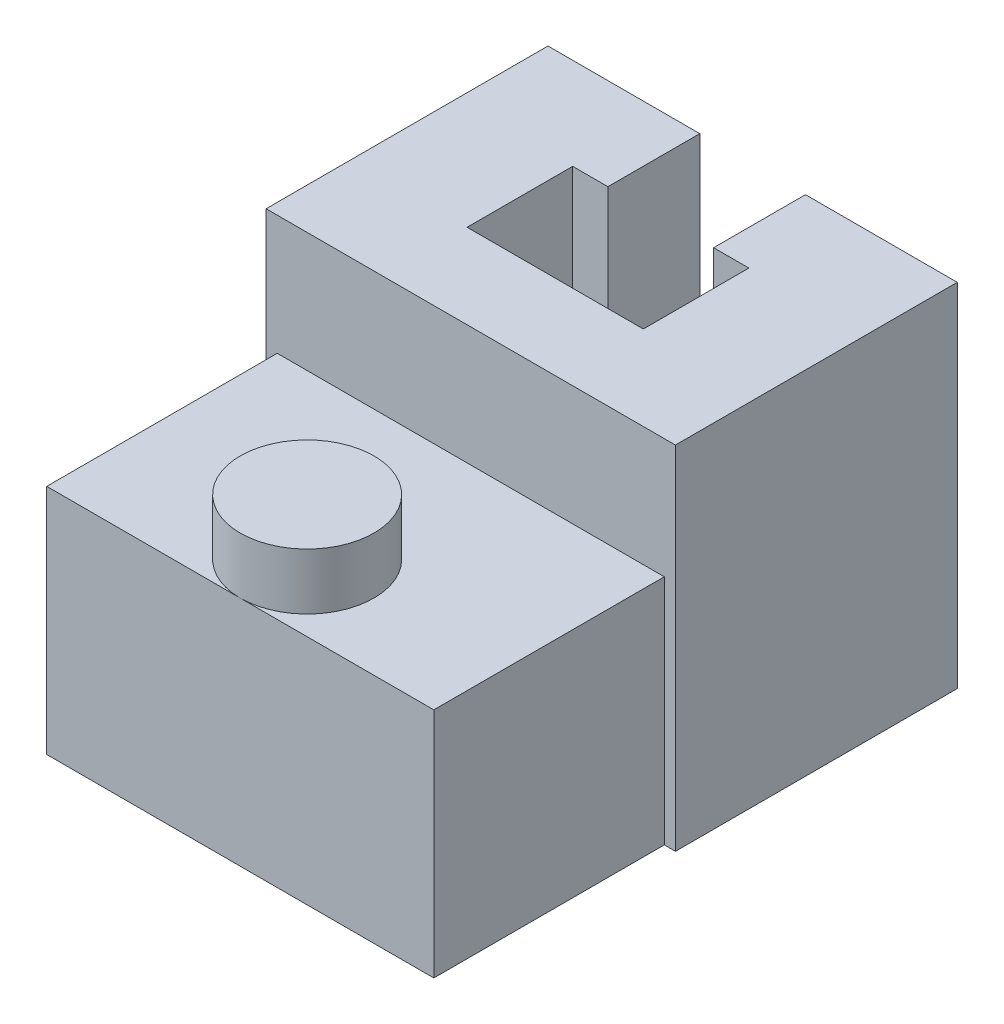
ISO-10303-21;
HEADER;
FILE_DESCRIPTION(('STEP AP214'),'2;1');
FILE_NAME('part.step','',(''),(''),'','','');
FILE_SCHEMA(('AUTOMOTIVE_DESIGN { 1 0 10303 214 1 1 1 1 }'));
ENDSEC;
DATA;
#1=APPLICATION_CONTEXT('core data for automotive mechanical design processes');
#2=APPLICATION_PROTOCOL_DEFINITION('international standard','automotive_design',2000,#1);
#3=PRODUCT_CONTEXT('',#1,'mechanical');
#4=PRODUCT('Part','Part','',(#3));
#5=PRODUCT_RELATED_PRODUCT_CATEGORY('part','',(#4));
#6=PRODUCT_DEFINITION_FORMATION('','',#4);
#7=PRODUCT_DEFINITION_CONTEXT('part definition',#1,'design');
#8=PRODUCT_DEFINITION('design','',#6,#7);
#9=PRODUCT_DEFINITION_SHAPE('','',#8);
#10=(LENGTH_UNIT() NAMED_UNIT(*) SI_UNIT(.MILLI.,.METRE.));
#11=(NAMED_UNIT(*) PLANE_ANGLE_UNIT() SI_UNIT($,.RADIAN.));
#12=(NAMED_UNIT(*) SI_UNIT($,.STERADIAN.) SOLID_ANGLE_UNIT());
#13=UNCERTAINTY_MEASURE_WITH_UNIT(LENGTH_MEASURE(1.E-05),#10,'distance_accuracy_value','');
#14=(GEOMETRIC_REPRESENTATION_CONTEXT(3) GLOBAL_UNCERTAINTY_ASSIGNED_CONTEXT((#13)) GLOBAL_UNIT_ASSIGNED_CONTEXT((#10,
#11,#12)) REPRESENTATION_CONTEXT('',''));
#15=CARTESIAN_POINT('',(0.,0.,0.));
#16=DIRECTION('',(0.,0.,1.));
#17=DIRECTION('',(1.,0.,0.));
#18=AXIS2_PLACEMENT_3D('',#15,#16,#17);
#19=CARTESIAN_POINT('',(16.7299239462037,-127.,-28.3014546756614));
#20=DIRECTION('',(0.,0.,1.));
#21=DIRECTION('',(1.,0.,0.));
#22=AXIS2_PLACEMENT_3D('',#19,#20,#21);
#23=PLANE('',#22);
#24=DIRECTION('',(1.,0.,0.));
#25=VECTOR('',#24,1.);
#26=CARTESIAN_POINT('',(16.7299239462037,0.,-28.3014546756614));
#27=LINE('',#26,#25);
#28=CARTESIAN_POINT('',(16.7299239462037,0.,-28.3014546756614));
#29=VERTEX_POINT('',#28);
#30=CARTESIAN_POINT('',(29.4553239462037,0.,-28.3014546756614));
#31=VERTEX_POINT('',#30);
#32=EDGE_CURVE('E208',#29,#31,#27,.T.);
#33=ORIENTED_EDGE('',*,*,#32,.F.);
#34=DIRECTION('',(0.,1.,0.));
#35=VECTOR('',#34,1.);
#36=CARTESIAN_POINT('',(16.7299239462037,-127.,-28.3014546756614));
#37=LINE('',#36,#35);
#38=CARTESIAN_POINT('',(16.7299239462037,-127.,-28.3014546756614));
#39=VERTEX_POINT('',#38);
#40=EDGE_CURVE('E11',#39,#29,#37,.T.);
#41=ORIENTED_EDGE('',*,*,#40,.F.);
#42=DIRECTION('',(1.,0.,0.));
#43=VECTOR('',#42,1.);
#44=CARTESIAN_POINT('',(16.7299239462037,-127.,-28.3014546756614));
#45=LINE('',#44,#43);
#46=CARTESIAN_POINT('',(29.4553239462037,-127.,-28.3014546756614));
#47=VERTEX_POINT('',#46);
#48=EDGE_CURVE('E212',#39,#47,#45,.T.);
#49=ORIENTED_EDGE('',*,*,#48,.T.);
#50=DIRECTION('',(0.,1.,0.));
#51=VECTOR('',#50,1.);
#52=CARTESIAN_POINT('',(29.4553239462037,-127.,-28.3014546756614));
#53=LINE('',#52,#51);
#54=EDGE_CURVE('E48',#47,#31,#53,.T.);
#55=ORIENTED_EDGE('',*,*,#54,.T.);
#56=EDGE_LOOP('',(#33,#41,#49,#55));
#57=FACE_BOUND('',#56,.T.);
#58=ADVANCED_FACE('F44',(#57),#23,.T.);
#59=CARTESIAN_POINT('',(16.7299239462037,-127.,-28.3014546756614));
#60=DIRECTION('',(1.,0.,0.));
#61=DIRECTION('',(0.,0.,-1.));
#62=AXIS2_PLACEMENT_3D('',#59,#60,#61);
#63=PLANE('',#62);
#64=DIRECTION('',(0.,0.,-1.));
#65=VECTOR('',#64,1.);
#66=CARTESIAN_POINT('',(16.7299239462037,0.,-28.3014546756614));
#67=LINE('',#66,#65);
#68=CARTESIAN_POINT('',(16.7299239462037,0.,9.79854532433865));
#69=VERTEX_POINT('',#68);
#70=EDGE_CURVE('E218',#69,#29,#67,.T.);
#71=ORIENTED_EDGE('',*,*,#70,.F.);
#72=DIRECTION('',(0.,1.,0.));
#73=VECTOR('',#72,1.);
#74=CARTESIAN_POINT('',(16.7299239462037,-127.,9.79854532433865));
#75=LINE('',#74,#73);
#76=CARTESIAN_POINT('',(16.7299239462037,-127.,9.79854532433865));
#77=VERTEX_POINT('',#76);
#78=EDGE_CURVE('E53',#77,#69,#75,.T.);
#79=ORIENTED_EDGE('',*,*,#78,.F.);
#80=DIRECTION('',(0.,0.,-1.));
#81=VECTOR('',#80,1.);
#82=CARTESIAN_POINT('',(16.7299239462037,-127.,-28.3014546756614));
#83=LINE('',#82,#81);
#84=EDGE_CURVE('E259',#77,#39,#83,.T.);
#85=ORIENTED_EDGE('',*,*,#84,.T.);
#86=ORIENTED_EDGE('',*,*,#40,.T.);
#87=EDGE_LOOP('',(#71,#79,#85,#86));
#88=FACE_BOUND('',#87,.T.);
#89=ADVANCED_FACE('F348',(#88),#63,.T.);
#90=CARTESIAN_POINT('',(16.7299239462037,-127.,9.79854532433865));
#91=DIRECTION('',(0.,0.,-1.));
#92=DIRECTION('',(-1.,0.,0.));
#93=AXIS2_PLACEMENT_3D('',#90,#91,#92);
#94=PLANE('',#93);
#95=DIRECTION('',(-1.,0.,0.));
#96=VECTOR('',#95,1.);
#97=CARTESIAN_POINT('',(16.7299239462037,0.,9.79854532433865));
#98=LINE('',#97,#96);
#99=CARTESIAN_POINT('',(80.3315239462037,0.,9.79854532433865));
#100=VERTEX_POINT('',#99);
#101=EDGE_CURVE('E305',#100,#69,#98,.T.);
#102=ORIENTED_EDGE('',*,*,#101,.F.);
#103=DIRECTION('',(0.,1.,0.));
#104=VECTOR('',#103,1.);
#105=CARTESIAN_POINT('',(80.3315239462037,-127.,9.79854532433865));
#106=LINE('',#105,#104);
#107=CARTESIAN_POINT('',(80.3315239462037,-127.,9.79854532433865));
#108=VERTEX_POINT('',#107);
#109=EDGE_CURVE('E313',#108,#100,#106,.T.);
#110=ORIENTED_EDGE('',*,*,#109,.F.);
#111=DIRECTION('',(-1.,0.,0.));
#112=VECTOR('',#111,1.);
#113=CARTESIAN_POINT('',(16.7299239462037,-127.,9.79854532433865));
#114=LINE('',#113,#112);
#115=EDGE_CURVE('E254',#108,#77,#114,.T.);
#116=ORIENTED_EDGE('',*,*,#115,.T.);
#117=ORIENTED_EDGE('',*,*,#78,.T.);
#118=EDGE_LOOP('',(#102,#110,#116,#117));
#119=FACE_BOUND('',#118,.T.);
#120=ADVANCED_FACE('F387',(#119),#94,.T.);
#121=CARTESIAN_POINT('',(80.3315239462037,-127.,9.79854532433865));
#122=DIRECTION('',(-1.,0.,0.));
#123=DIRECTION('',(0.,0.,1.));
#124=AXIS2_PLACEMENT_3D('',#121,#122,#123);
#125=PLANE('',#124);
#126=DIRECTION('',(0.,0.,1.));
#127=VECTOR('',#126,1.);
#128=CARTESIAN_POINT('',(80.3315239462037,0.,9.79854532433865));
#129=LINE('',#128,#127);
#130=CARTESIAN_POINT('',(80.3315239462037,0.,-28.3014546756614));
#131=VERTEX_POINT('',#130);
#132=EDGE_CURVE('E299',#131,#100,#129,.T.);
#133=ORIENTED_EDGE('',*,*,#132,.F.);
#134=DIRECTION('',(0.,1.,0.));
#135=VECTOR('',#134,1.);
#136=CARTESIAN_POINT('',(80.3315239462037,-127.,-28.3014546756614));
#137=LINE('',#136,#135);
#138=CARTESIAN_POINT('',(80.3315239462037,-127.,-28.3014546756614));
#139=VERTEX_POINT('',#138);
#140=EDGE_CURVE('E314',#139,#131,#137,.T.);
#141=ORIENTED_EDGE('',*,*,#140,.F.);
#142=DIRECTION('',(0.,0.,1.));
#143=VECTOR('',#142,1.);
#144=CARTESIAN_POINT('',(80.3315239462037,-127.,9.79854532433865));
#145=LINE('',#144,#143);
#146=EDGE_CURVE('E253',#139,#108,#145,.T.);
#147=ORIENTED_EDGE('',*,*,#146,.T.);
#148=ORIENTED_EDGE('',*,*,#109,.T.);
#149=EDGE_LOOP('',(#133,#141,#147,#148));
#150=FACE_BOUND('',#149,.T.);
#151=ADVANCED_FACE('F382',(#150),#125,.T.);
#152=CARTESIAN_POINT('',(80.3315239462037,-127.,-28.3014546756614));
#153=DIRECTION('',(0.,0.,1.));
#154=DIRECTION('',(1.,0.,0.));
#155=AXIS2_PLACEMENT_3D('',#152,#153,#154);
#156=PLANE('',#155);
#157=DIRECTION('',(1.,0.,0.));
#158=VECTOR('',#157,1.);
#159=CARTESIAN_POINT('',(80.3315239462037,0.,-28.3014546756614));
#160=LINE('',#159,#158);
#161=CARTESIAN_POINT('',(67.6061239462037,0.,-28.3014546756614));
#162=VERTEX_POINT('',#161);
#163=EDGE_CURVE('E294',#162,#131,#160,.T.);
#164=ORIENTED_EDGE('',*,*,#163,.F.);
#165=DIRECTION('',(0.,1.,0.));
#166=VECTOR('',#165,1.);
#167=CARTESIAN_POINT('',(67.6061239462037,-127.,-28.3014546756614));
#168=LINE('',#167,#166);
#169=CARTESIAN_POINT('',(67.6061239462037,-127.,-28.3014546756614));
#170=VERTEX_POINT('',#169);
#171=EDGE_CURVE('E320',#170,#162,#168,.T.);
#172=ORIENTED_EDGE('',*,*,#171,.F.);
#173=DIRECTION('',(1.,0.,0.));
#174=VECTOR('',#173,1.);
#175=CARTESIAN_POINT('',(80.3315239462037,-127.,-28.3014546756614));
#176=LINE('',#175,#174);
#177=EDGE_CURVE('E250',#170,#139,#176,.T.);
#178=ORIENTED_EDGE('',*,*,#177,.T.);
#179=ORIENTED_EDGE('',*,*,#140,.T.);
#180=EDGE_LOOP('',(#164,#172,#178,#179));
#181=FACE_BOUND('',#180,.T.);
#182=ADVANCED_FACE('F379',(#181),#156,.T.);
#183=CARTESIAN_POINT('',(67.6061239462037,-127.,-28.3014546756614));
#184=DIRECTION('',(-1.,0.,0.));
#185=DIRECTION('',(0.,0.,1.));
#186=AXIS2_PLACEMENT_3D('',#183,#184,#185);
#187=PLANE('',#186);
#188=DIRECTION('',(0.,0.,1.));
#189=VECTOR('',#188,1.);
#190=CARTESIAN_POINT('',(67.6061239462037,0.,-28.3014546756614));
#191=LINE('',#190,#189);
#192=CARTESIAN_POINT('',(67.6061239462037,0.,-61.4484546756613));
#193=VERTEX_POINT('',#192);
#194=EDGE_CURVE('E288',#193,#162,#191,.T.);
#195=ORIENTED_EDGE('',*,*,#194,.F.);
#196=DIRECTION('',(0.,1.,0.));
#197=VECTOR('',#196,1.);
#198=CARTESIAN_POINT('',(67.6061239462037,-127.,-61.4484546756613));
#199=LINE('',#198,#197);
#200=CARTESIAN_POINT('',(67.6061239462037,-127.,-61.4484546756613));
#201=VERTEX_POINT('',#200);
#202=EDGE_CURVE('E319',#201,#193,#199,.T.);
#203=ORIENTED_EDGE('',*,*,#202,.F.);
#204=DIRECTION('',(0.,0.,1.));
#205=VECTOR('',#204,1.);
#206=CARTESIAN_POINT('',(67.6061239462037,-127.,-28.3014546756614));
#207=LINE('',#206,#205);
#208=EDGE_CURVE('E244',#201,#170,#207,.T.);
#209=ORIENTED_EDGE('',*,*,#208,.T.);
#210=ORIENTED_EDGE('',*,*,#171,.T.);
#211=EDGE_LOOP('',(#195,#203,#209,#210));
#212=FACE_BOUND('',#211,.T.);
#213=ADVANCED_FACE('F376',(#212),#187,.T.);
#214=CARTESIAN_POINT('',(122.393923946204,-127.,-61.4484546756613));
#215=DIRECTION('',(0.,0.,-1.));
#216=DIRECTION('',(-1.,0.,0.));
#217=AXIS2_PLACEMENT_3D('',#214,#215,#216);
#218=PLANE('',#217);
#219=DIRECTION('',(-1.,0.,0.));
#220=VECTOR('',#219,1.);
#221=CARTESIAN_POINT('',(122.393923946204,0.,-61.4484546756613));
#222=LINE('',#221,#220);
#223=CARTESIAN_POINT('',(122.393923946204,0.,-61.4484546756613));
#224=VERTEX_POINT('',#223);
#225=EDGE_CURVE('E287',#224,#193,#222,.T.);
#226=ORIENTED_EDGE('',*,*,#225,.F.);
#227=DIRECTION('',(0.,1.,0.));
#228=VECTOR('',#227,1.);
#229=CARTESIAN_POINT('',(122.393923946204,-127.,-61.4484546756613));
#230=LINE('',#229,#228);
#231=CARTESIAN_POINT('',(122.393923946204,-127.,-61.4484546756613));
#232=VERTEX_POINT('',#231);
#233=EDGE_CURVE('E323',#232,#224,#230,.T.);
#234=ORIENTED_EDGE('',*,*,#233,.F.);
#235=DIRECTION('',(-1.,0.,0.));
#236=VECTOR('',#235,1.);
#237=CARTESIAN_POINT('',(122.393923946204,-127.,-61.4484546756613));
#238=LINE('',#237,#236);
#239=EDGE_CURVE('E239',#232,#201,#238,.T.);
#240=ORIENTED_EDGE('',*,*,#239,.T.);
#241=ORIENTED_EDGE('',*,*,#202,.T.);
#242=EDGE_LOOP('',(#226,#234,#240,#241));
#243=FACE_BOUND('',#242,.T.);
#244=ADVANCED_FACE('F375',(#243),#218,.T.);
#245=CARTESIAN_POINT('',(122.393923946204,-127.,40.2785453243387));
#246=DIRECTION('',(1.,0.,0.));
#247=DIRECTION('',(0.,0.,-1.));
#248=AXIS2_PLACEMENT_3D('',#245,#246,#247);
#249=PLANE('',#248);
#250=DIRECTION('',(0.,0.,-1.));
#251=VECTOR('',#250,1.);
#252=CARTESIAN_POINT('',(122.393923946204,0.,40.2785453243387));
#253=LINE('',#252,#251);
#254=CARTESIAN_POINT('',(122.393923946204,0.,40.2785453243387));
#255=VERTEX_POINT('',#254);
#256=EDGE_CURVE('E285',#255,#224,#253,.T.);
#257=ORIENTED_EDGE('',*,*,#256,.F.);
#258=DIRECTION('',(0.,1.,0.));
#259=VECTOR('',#258,1.);
#260=CARTESIAN_POINT('',(122.393923946204,-127.,40.2785453243387));
#261=LINE('',#260,#259);
#262=CARTESIAN_POINT('',(122.393923946204,-127.,40.2785453243387));
#263=VERTEX_POINT('',#262);
#264=EDGE_CURVE('E326',#263,#255,#261,.T.);
#265=ORIENTED_EDGE('',*,*,#264,.F.);
#266=DIRECTION('',(0.,0.,-1.));
#267=VECTOR('',#266,1.);
#268=CARTESIAN_POINT('',(122.393923946204,-127.,40.2785453243387));
#269=LINE('',#268,#267);
#270=EDGE_CURVE('E233',#263,#232,#269,.T.);
#271=ORIENTED_EDGE('',*,*,#270,.T.);
#272=ORIENTED_EDGE('',*,*,#233,.T.);
#273=EDGE_LOOP('',(#257,#265,#271,#272));
#274=FACE_BOUND('',#273,.T.);
#275=ADVANCED_FACE('F366',(#274),#249,.T.);
#276=CARTESIAN_POINT('',(-25.3324760537963,-127.,40.2785453243387));
#277=DIRECTION('',(0.,0.,1.));
#278=DIRECTION('',(1.,0.,0.));
#279=AXIS2_PLACEMENT_3D('',#276,#277,#278);
#280=PLANE('',#279);
#281=DIRECTION('',(0.,-1.,0.));
#282=VECTOR('',#281,1.);
#283=CARTESIAN_POINT('',(-21.3192760537963,-43.18,40.2785453243387));
#284=LINE('',#283,#282);
#285=CARTESIAN_POINT('',(-21.3192760537963,-43.18,40.2785453243387));
#286=VERTEX_POINT('',#285);
#287=CARTESIAN_POINT('',(-21.3192760537963,-127.,40.2785453243387));
#288=VERTEX_POINT('',#287);
#289=EDGE_CURVE('E183',#286,#288,#284,.T.);
#290=ORIENTED_EDGE('',*,*,#289,.F.);
#291=DIRECTION('',(1.,0.,0.));
#292=VECTOR('',#291,1.);
#293=CARTESIAN_POINT('',(118.380723946204,-43.18,40.2785453243387));
#294=LINE('',#293,#292);
#295=CARTESIAN_POINT('',(118.380723946204,-43.18,40.2785453243387));
#296=VERTEX_POINT('',#295);
#297=EDGE_CURVE('E173',#286,#296,#294,.T.);
#298=ORIENTED_EDGE('',*,*,#297,.T.);
#299=DIRECTION('',(0.,-1.,0.));
#300=VECTOR('',#299,1.);
#301=CARTESIAN_POINT('',(118.380723946204,-43.18,40.2785453243387));
#302=LINE('',#301,#300);
#303=CARTESIAN_POINT('',(118.380723946204,-127.,40.2785453243387));
#304=VERTEX_POINT('',#303);
#305=EDGE_CURVE('E157',#296,#304,#302,.T.);
#306=ORIENTED_EDGE('',*,*,#305,.T.);
#307=DIRECTION('',(1.,0.,0.));
#308=VECTOR('',#307,1.);
#309=CARTESIAN_POINT('',(-25.3324760537963,-127.,40.2785453243387));
#310=LINE('',#309,#308);
#311=EDGE_CURVE('E232',#304,#263,#310,.T.);
#312=ORIENTED_EDGE('',*,*,#311,.T.);
#313=ORIENTED_EDGE('',*,*,#264,.T.);
#314=DIRECTION('',(1.,0.,0.));
#315=VECTOR('',#314,1.);
#316=CARTESIAN_POINT('',(-25.3324760537963,0.,40.2785453243387));
#317=LINE('',#316,#315);
#318=CARTESIAN_POINT('',(-25.3324760537963,0.,40.2785453243387));
#319=VERTEX_POINT('',#318);
#320=EDGE_CURVE('E279',#319,#255,#317,.T.);
#321=ORIENTED_EDGE('',*,*,#320,.F.);
#322=DIRECTION('',(0.,1.,0.));
#323=VECTOR('',#322,1.);
#324=CARTESIAN_POINT('',(-25.3324760537963,-127.,40.2785453243387));
#325=LINE('',#324,#323);
#326=CARTESIAN_POINT('',(-25.3324760537963,-127.,40.2785453243387));
#327=VERTEX_POINT('',#326);
#328=EDGE_CURVE('E328',#327,#319,#325,.T.);
#329=ORIENTED_EDGE('',*,*,#328,.F.);
#330=EDGE_CURVE('E235',#327,#288,#310,.T.);
#331=ORIENTED_EDGE('',*,*,#330,.T.);
#332=EDGE_LOOP('',(#290,#298,#306,#312,#313,#321,#329,#331));
#333=FACE_BOUND('',#332,.T.);
#334=ADVANCED_FACE('F181',(#333),#280,.T.);
#335=CARTESIAN_POINT('',(-25.3324760537963,-127.,-61.4484546756613));
#336=DIRECTION('',(-1.,0.,0.));
#337=DIRECTION('',(0.,0.,1.));
#338=AXIS2_PLACEMENT_3D('',#335,#336,#337);
#339=PLANE('',#338);
#340=DIRECTION('',(0.,0.,1.));
#341=VECTOR('',#340,1.);
#342=CARTESIAN_POINT('',(-25.3324760537963,0.,-61.4484546756613));
#343=LINE('',#342,#341);
#344=CARTESIAN_POINT('',(-25.3324760537963,0.,-61.4484546756613));
#345=VERTEX_POINT('',#344);
#346=EDGE_CURVE('E273',#345,#319,#343,.T.);
#347=ORIENTED_EDGE('',*,*,#346,.F.);
#348=DIRECTION('',(0.,1.,0.));
#349=VECTOR('',#348,1.);
#350=CARTESIAN_POINT('',(-25.3324760537963,-127.,-61.4484546756613));
#351=LINE('',#350,#349);
#352=CARTESIAN_POINT('',(-25.3324760537963,-127.,-61.4484546756613));
#353=VERTEX_POINT('',#352);
#354=EDGE_CURVE('E335',#353,#345,#351,.T.);
#355=ORIENTED_EDGE('',*,*,#354,.F.);
#356=DIRECTION('',(0.,0.,1.));
#357=VECTOR('',#356,1.);
#358=CARTESIAN_POINT('',(-25.3324760537963,-127.,-61.4484546756613));
#359=LINE('',#358,#357);
#360=EDGE_CURVE('E230',#353,#327,#359,.T.);
#361=ORIENTED_EDGE('',*,*,#360,.T.);
#362=ORIENTED_EDGE('',*,*,#328,.T.);
#363=EDGE_LOOP('',(#347,#355,#361,#362));
#364=FACE_BOUND('',#363,.T.);
#365=ADVANCED_FACE('F361',(#364),#339,.T.);
#366=CARTESIAN_POINT('',(29.4553239462037,-127.,-61.4484546756613));
#367=DIRECTION('',(0.,0.,-1.));
#368=DIRECTION('',(-1.,0.,0.));
#369=AXIS2_PLACEMENT_3D('',#366,#367,#368);
#370=PLANE('',#369);
#371=DIRECTION('',(-1.,0.,0.));
#372=VECTOR('',#371,1.);
#373=CARTESIAN_POINT('',(29.4553239462037,0.,-61.4484546756613));
#374=LINE('',#373,#372);
#375=CARTESIAN_POINT('',(29.4553239462037,0.,-61.4484546756613));
#376=VERTEX_POINT('',#375);
#377=EDGE_CURVE('E269',#376,#345,#374,.T.);
#378=ORIENTED_EDGE('',*,*,#377,.F.);
#379=DIRECTION('',(0.,1.,0.));
#380=VECTOR('',#379,1.);
#381=CARTESIAN_POINT('',(29.4553239462037,-127.,-61.4484546756613));
#382=LINE('',#381,#380);
#383=CARTESIAN_POINT('',(29.4553239462037,-127.,-61.4484546756613));
#384=VERTEX_POINT('',#383);
#385=EDGE_CURVE('E331',#384,#376,#382,.T.);
#386=ORIENTED_EDGE('',*,*,#385,.F.);
#387=DIRECTION('',(-1.,0.,0.));
#388=VECTOR('',#387,1.);
#389=CARTESIAN_POINT('',(29.4553239462037,-127.,-61.4484546756613));
#390=LINE('',#389,#388);
#391=EDGE_CURVE('E224',#384,#353,#390,.T.);
#392=ORIENTED_EDGE('',*,*,#391,.T.);
#393=ORIENTED_EDGE('',*,*,#354,.T.);
#394=EDGE_LOOP('',(#378,#386,#392,#393));
#395=FACE_BOUND('',#394,.T.);
#396=ADVANCED_FACE('F356',(#395),#370,.T.);
#397=CARTESIAN_POINT('',(29.4553239462037,-127.,-28.3014546756614));
#398=DIRECTION('',(1.,0.,0.));
#399=DIRECTION('',(0.,0.,-1.));
#400=AXIS2_PLACEMENT_3D('',#397,#398,#399);
#401=PLANE('',#400);
#402=DIRECTION('',(0.,0.,-1.));
#403=VECTOR('',#402,1.);
#404=CARTESIAN_POINT('',(29.4553239462037,0.,-28.3014546756614));
#405=LINE('',#404,#403);
#406=EDGE_CURVE('E266',#31,#376,#405,.T.);
#407=ORIENTED_EDGE('',*,*,#406,.F.);
#408=ORIENTED_EDGE('',*,*,#54,.F.);
#409=DIRECTION('',(0.,0.,-1.));
#410=VECTOR('',#409,1.);
#411=CARTESIAN_POINT('',(29.4553239462037,-127.,-28.3014546756614));
#412=LINE('',#411,#410);
#413=EDGE_CURVE('E217',#47,#384,#412,.T.);
#414=ORIENTED_EDGE('',*,*,#413,.T.);
#415=ORIENTED_EDGE('',*,*,#385,.T.);
#416=EDGE_LOOP('',(#407,#408,#414,#415));
#417=FACE_BOUND('',#416,.T.);
#418=ADVANCED_FACE('F341',(#417),#401,.T.);
#419=CARTESIAN_POINT('',(0.,-127.,0.));
#420=DIRECTION('',(0.,1.,0.));
#421=DIRECTION('',(0.,0.,1.));
#422=AXIS2_PLACEMENT_3D('',#419,#420,#421);
#423=PLANE('',#422);
#424=ORIENTED_EDGE('',*,*,#48,.F.);
#425=ORIENTED_EDGE('',*,*,#84,.F.);
#426=ORIENTED_EDGE('',*,*,#115,.F.);
#427=ORIENTED_EDGE('',*,*,#146,.F.);
#428=ORIENTED_EDGE('',*,*,#177,.F.);
#429=ORIENTED_EDGE('',*,*,#208,.F.);
#430=ORIENTED_EDGE('',*,*,#239,.F.);
#431=ORIENTED_EDGE('',*,*,#270,.F.);
#432=ORIENTED_EDGE('',*,*,#311,.F.);
#433=DIRECTION('',(0.,0.,1.));
#434=VECTOR('',#433,1.);
#435=CARTESIAN_POINT('',(118.380723946204,-127.,123.463545324339));
#436=LINE('',#435,#434);
#437=CARTESIAN_POINT('',(118.380723946204,-127.,123.463545324339));
#438=VERTEX_POINT('',#437);
#439=EDGE_CURVE('E70',#304,#438,#436,.T.);
#440=ORIENTED_EDGE('',*,*,#439,.T.);
#441=DIRECTION('',(-1.,0.,0.));
#442=VECTOR('',#441,1.);
#443=CARTESIAN_POINT('',(-21.3192760537963,-127.,123.463545324339));
#444=LINE('',#443,#442);
#445=CARTESIAN_POINT('',(-21.3192760537963,-127.,123.463545324339));
#446=VERTEX_POINT('',#445);
#447=EDGE_CURVE('E192',#438,#446,#444,.T.);
#448=ORIENTED_EDGE('',*,*,#447,.T.);
#449=DIRECTION('',(0.,0.,-1.));
#450=VECTOR('',#449,1.);
#451=CARTESIAN_POINT('',(-21.3192760537963,-127.,40.2785453243387));
#452=LINE('',#451,#450);
#453=EDGE_CURVE('E190',#446,#288,#452,.T.);
#454=ORIENTED_EDGE('',*,*,#453,.T.);
#455=ORIENTED_EDGE('',*,*,#330,.F.);
#456=ORIENTED_EDGE('',*,*,#360,.F.);
#457=ORIENTED_EDGE('',*,*,#391,.F.);
#458=ORIENTED_EDGE('',*,*,#413,.F.);
#459=EDGE_LOOP('',(#424,#425,#426,#427,#428,#429,#430,#431,#432,#440,#448,#454,#455,#456,#457,#458));
#460=FACE_BOUND('',#459,.T.);
#461=ADVANCED_FACE('F354',(#460),#423,.F.);
#462=CARTESIAN_POINT('',(0.,0.,0.));
#463=DIRECTION('',(0.,1.,0.));
#464=DIRECTION('',(0.,0.,1.));
#465=AXIS2_PLACEMENT_3D('',#462,#463,#464);
#466=PLANE('',#465);
#467=ORIENTED_EDGE('',*,*,#32,.T.);
#468=ORIENTED_EDGE('',*,*,#406,.T.);
#469=ORIENTED_EDGE('',*,*,#377,.T.);
#470=ORIENTED_EDGE('',*,*,#346,.T.);
#471=ORIENTED_EDGE('',*,*,#320,.T.);
#472=ORIENTED_EDGE('',*,*,#256,.T.);
#473=ORIENTED_EDGE('',*,*,#225,.T.);
#474=ORIENTED_EDGE('',*,*,#194,.T.);
#475=ORIENTED_EDGE('',*,*,#163,.T.);
#476=ORIENTED_EDGE('',*,*,#132,.T.);
#477=ORIENTED_EDGE('',*,*,#101,.T.);
#478=ORIENTED_EDGE('',*,*,#70,.T.);
#479=EDGE_LOOP('',(#467,#468,#469,#470,#471,#472,#473,#474,#475,#476,#477,#478));
#480=FACE_BOUND('',#479,.T.);
#481=ADVANCED_FACE('F347',(#480),#466,.T.);
#482=CARTESIAN_POINT('',(-21.3192760537963,-43.18,40.2785453243387));
#483=DIRECTION('',(-1.,0.,0.));
#484=DIRECTION('',(0.,0.,1.));
#485=AXIS2_PLACEMENT_3D('',#482,#483,#484);
#486=PLANE('',#485);
#487=ORIENTED_EDGE('',*,*,#453,.F.);
#488=DIRECTION('',(0.,-1.,0.));
#489=VECTOR('',#488,1.);
#490=CARTESIAN_POINT('',(-21.3192760537963,-43.18,123.463545324339));
#491=LINE('',#490,#489);
#492=CARTESIAN_POINT('',(-21.3192760537963,-43.18,123.463545324339));
#493=VERTEX_POINT('',#492);
#494=EDGE_CURVE('E207',#493,#446,#491,.T.);
#495=ORIENTED_EDGE('',*,*,#494,.F.);
#496=DIRECTION('',(0.,0.,-1.));
#497=VECTOR('',#496,1.);
#498=CARTESIAN_POINT('',(-21.3192760537963,-43.18,40.2785453243387));
#499=LINE('',#498,#497);
#500=EDGE_CURVE('E169',#493,#286,#499,.T.);
#501=ORIENTED_EDGE('',*,*,#500,.T.);
#502=ORIENTED_EDGE('',*,*,#289,.T.);
#503=EDGE_LOOP('',(#487,#495,#501,#502));
#504=FACE_BOUND('',#503,.T.);
#505=ADVANCED_FACE('F393',(#504),#486,.T.);
#506=CARTESIAN_POINT('',(-21.3192760537963,-43.18,123.463545324339));
#507=DIRECTION('',(0.,0.,1.));
#508=DIRECTION('',(1.,0.,0.));
#509=AXIS2_PLACEMENT_3D('',#506,#507,#508);
#510=PLANE('',#509);
#511=ORIENTED_EDGE('',*,*,#447,.F.);
#512=DIRECTION('',(0.,-1.,0.));
#513=VECTOR('',#512,1.);
#514=CARTESIAN_POINT('',(118.380723946204,-43.18,123.463545324339));
#515=LINE('',#514,#513);
#516=CARTESIAN_POINT('',(118.380723946204,-43.18,123.463545324339));
#517=VERTEX_POINT('',#516);
#518=EDGE_CURVE('E170',#517,#438,#515,.T.);
#519=ORIENTED_EDGE('',*,*,#518,.F.);
#520=DIRECTION('',(-1.,0.,0.));
#521=VECTOR('',#520,1.);
#522=CARTESIAN_POINT('',(-21.3192760537963,-43.18,123.463545324339));
#523=LINE('',#522,#521);
#524=CARTESIAN_POINT('',(48.5307239462037,-43.18,123.463545324339));
#525=VERTEX_POINT('',#524);
#526=EDGE_CURVE('E179',#517,#525,#523,.T.);
#527=ORIENTED_EDGE('',*,*,#526,.T.);
#528=EDGE_CURVE('E178',#525,#493,#523,.T.);
#529=ORIENTED_EDGE('',*,*,#528,.T.);
#530=ORIENTED_EDGE('',*,*,#494,.T.);
#531=EDGE_LOOP('',(#511,#519,#527,#529,#530));
#532=FACE_BOUND('',#531,.T.);
#533=ADVANCED_FACE('F395',(#532),#510,.T.);
#534=CARTESIAN_POINT('',(118.380723946204,-43.18,123.463545324339));
#535=DIRECTION('',(1.,0.,0.));
#536=DIRECTION('',(0.,0.,-1.));
#537=AXIS2_PLACEMENT_3D('',#534,#535,#536);
#538=PLANE('',#537);
#539=ORIENTED_EDGE('',*,*,#439,.F.);
#540=ORIENTED_EDGE('',*,*,#305,.F.);
#541=DIRECTION('',(0.,0.,1.));
#542=VECTOR('',#541,1.);
#543=CARTESIAN_POINT('',(118.380723946204,-43.18,123.463545324339));
#544=LINE('',#543,#542);
#545=EDGE_CURVE('E165',#296,#517,#544,.T.);
#546=ORIENTED_EDGE('',*,*,#545,.T.);
#547=ORIENTED_EDGE('',*,*,#518,.T.);
#548=EDGE_LOOP('',(#539,#540,#546,#547));
#549=FACE_BOUND('',#548,.T.);
#550=ADVANCED_FACE('F161',(#549),#538,.T.);
#551=CARTESIAN_POINT('',(0.,-43.18,0.));
#552=DIRECTION('',(0.,1.,0.));
#553=DIRECTION('',(0.,0.,1.));
#554=AXIS2_PLACEMENT_3D('',#551,#552,#553);
#555=PLANE('',#554);
#556=ORIENTED_EDGE('',*,*,#528,.F.);
#557=CARTESIAN_POINT('',(48.5307239462037,-43.18,99.3335453243386));
#558=DIRECTION('',(0.,1.,0.));
#559=DIRECTION('',(0.,0.,1.));
#560=AXIS2_PLACEMENT_3D('',#557,#558,#559);
#561=CIRCLE('',#560,24.13);
#562=EDGE_CURVE('E58',#525,#525,#561,.T.);
#563=ORIENTED_EDGE('',*,*,#562,.F.);
#564=ORIENTED_EDGE('',*,*,#526,.F.);
#565=ORIENTED_EDGE('',*,*,#545,.F.);
#566=ORIENTED_EDGE('',*,*,#297,.F.);
#567=ORIENTED_EDGE('',*,*,#500,.F.);
#568=EDGE_LOOP('',(#556,#563,#564,#565,#566,#567));
#569=FACE_BOUND('',#568,.T.);
#570=ADVANCED_FACE('F174',(#569),#555,.T.);
#571=CARTESIAN_POINT('',(48.5307239462037,-22.86,99.3335453243386));
#572=DIRECTION('',(0.,-1.,0.));
#573=DIRECTION('',(0.,0.,-1.));
#574=AXIS2_PLACEMENT_3D('',#571,#572,#573);
#575=CYLINDRICAL_SURFACE('',#574,24.13);
#576=CARTESIAN_POINT('',(48.5307239462037,-22.86,99.3335453243386));
#577=DIRECTION('',(0.,1.,0.));
#578=DIRECTION('',(0.,0.,1.));
#579=AXIS2_PLACEMENT_3D('',#576,#577,#578);
#580=CIRCLE('',#579,24.13);
#581=CARTESIAN_POINT('',(48.5307239462037,-22.86,123.463545324339));
#582=VERTEX_POINT('',#581);
#583=EDGE_CURVE('E205',#582,#582,#580,.T.);
#584=ORIENTED_EDGE('',*,*,#583,.F.);
#585=EDGE_LOOP('',(#584));
#586=FACE_BOUND('',#585,.T.);
#587=ORIENTED_EDGE('',*,*,#562,.T.);
#588=EDGE_LOOP('',(#587));
#589=FACE_BOUND('',#588,.T.);
#590=ADVANCED_FACE('F445',(#586,#589),#575,.T.);
#591=CARTESIAN_POINT('',(48.5307239462037,-22.86,99.3335453243386));
#592=DIRECTION('',(0.,1.,0.));
#593=DIRECTION('',(0.,0.,1.));
#594=AXIS2_PLACEMENT_3D('',#591,#592,#593);
#595=PLANE('',#594);
#596=ORIENTED_EDGE('',*,*,#583,.T.);
#597=EDGE_LOOP('',(#596));
#598=FACE_BOUND('',#597,.T.);
#599=ADVANCED_FACE('F447',(#598),#595,.T.);
#600=CLOSED_SHELL('',(#58,#89,#120,#151,#182,#213,#244,#275,#334,#365,#396,#418,#461,#481,#505,
#533,#550,#570,#590,#599));
#601=MANIFOLD_SOLID_BREP('B2',#600);
#602=ADVANCED_BREP_SHAPE_REPRESENTATION('',(#18,#601),#14);
#603=SHAPE_DEFINITION_REPRESENTATION(#9,#602);
ENDSEC;
END-ISO-10303-21;
